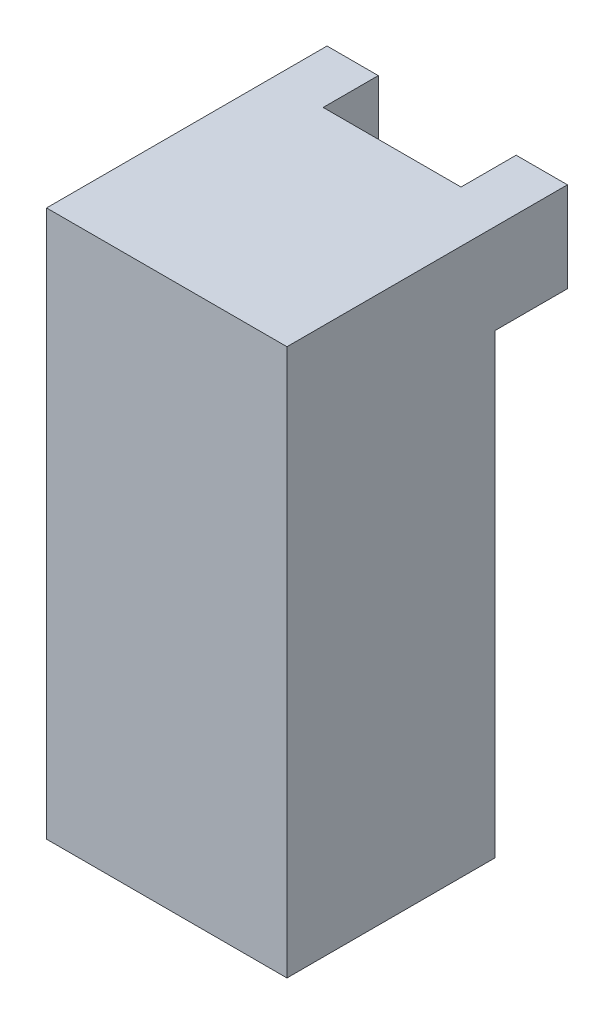
ISO-10303-21;
HEADER;
FILE_DESCRIPTION(('STEP AP214'),'2;1');
FILE_NAME('part.step','',(''),(''),'','','');
FILE_SCHEMA(('AUTOMOTIVE_DESIGN { 1 0 10303 214 1 1 1 1 }'));
ENDSEC;
DATA;
#1=APPLICATION_CONTEXT('core data for automotive mechanical design processes');
#2=APPLICATION_PROTOCOL_DEFINITION('international standard','automotive_design',2000,#1);
#3=PRODUCT_CONTEXT('',#1,'mechanical');
#4=PRODUCT('Part','Part','',(#3));
#5=PRODUCT_RELATED_PRODUCT_CATEGORY('part','',(#4));
#6=PRODUCT_DEFINITION_FORMATION('','',#4);
#7=PRODUCT_DEFINITION_CONTEXT('part definition',#1,'design');
#8=PRODUCT_DEFINITION('design','',#6,#7);
#9=PRODUCT_DEFINITION_SHAPE('','',#8);
#10=(LENGTH_UNIT() NAMED_UNIT(*) SI_UNIT(.MILLI.,.METRE.));
#11=(NAMED_UNIT(*) PLANE_ANGLE_UNIT() SI_UNIT($,.RADIAN.));
#12=(NAMED_UNIT(*) SI_UNIT($,.STERADIAN.) SOLID_ANGLE_UNIT());
#13=UNCERTAINTY_MEASURE_WITH_UNIT(LENGTH_MEASURE(1.E-05),#10,'distance_accuracy_value','');
#14=(GEOMETRIC_REPRESENTATION_CONTEXT(3) GLOBAL_UNCERTAINTY_ASSIGNED_CONTEXT((#13)) GLOBAL_UNIT_ASSIGNED_CONTEXT((#10,
#11,#12)) REPRESENTATION_CONTEXT('',''));
#15=CARTESIAN_POINT('',(0.,0.,0.));
#16=DIRECTION('',(0.,0.,1.));
#17=DIRECTION('',(1.,0.,0.));
#18=AXIS2_PLACEMENT_3D('',#15,#16,#17);
#19=CARTESIAN_POINT('',(-2.79000000000003,6.345,-2.4149999999999));
#20=DIRECTION('',(0.,0.,1.));
#21=DIRECTION('',(1.,0.,0.));
#22=AXIS2_PLACEMENT_3D('',#19,#20,#21);
#23=PLANE('',#22);
#24=DIRECTION('',(1.,0.,0.));
#25=VECTOR('',#24,1.);
#26=CARTESIAN_POINT('',(-2.79000000000003,4.255,-2.4149999999999));
#27=LINE('',#26,#25);
#28=CARTESIAN_POINT('',(-2.79000000000003,4.255,-2.4149999999999));
#29=VERTEX_POINT('',#28);
#30=CARTESIAN_POINT('',(2.78999999999996,4.255,-2.41499999999992));
#31=VERTEX_POINT('',#30);
#32=EDGE_CURVE('E142',#29,#31,#27,.T.);
#33=ORIENTED_EDGE('',*,*,#32,.T.);
#34=DIRECTION('',(0.,-1.,0.));
#35=VECTOR('',#34,1.);
#36=CARTESIAN_POINT('',(2.78999999999996,6.345,-2.41499999999992));
#37=LINE('',#36,#35);
#38=CARTESIAN_POINT('',(2.78999999999997,-6.345,-2.41499999999993));
#39=VERTEX_POINT('',#38);
#40=EDGE_CURVE('E11',#31,#39,#37,.T.);
#41=ORIENTED_EDGE('',*,*,#40,.T.);
#42=DIRECTION('',(-1.,0.,0.));
#43=VECTOR('',#42,1.);
#44=CARTESIAN_POINT('',(-2.79000000000003,-6.345,-2.41499999999992));
#45=LINE('',#44,#43);
#46=CARTESIAN_POINT('',(-2.79000000000003,-6.345,-2.41499999999992));
#47=VERTEX_POINT('',#46);
#48=EDGE_CURVE('E168',#39,#47,#45,.T.);
#49=ORIENTED_EDGE('',*,*,#48,.T.);
#50=DIRECTION('',(0.,-1.,0.));
#51=VECTOR('',#50,1.);
#52=CARTESIAN_POINT('',(-2.79000000000003,6.345,-2.4149999999999));
#53=LINE('',#52,#51);
#54=EDGE_CURVE('E38',#29,#47,#53,.T.);
#55=ORIENTED_EDGE('',*,*,#54,.F.);
#56=EDGE_LOOP('',(#33,#41,#49,#55));
#57=FACE_BOUND('',#56,.T.);
#58=ADVANCED_FACE('F30',(#57),#23,.F.);
#59=CARTESIAN_POINT('',(2.78999999999998,6.345,2.41500000000001));
#60=DIRECTION('',(-1.,0.,0.));
#61=DIRECTION('',(0.,0.,1.));
#62=AXIS2_PLACEMENT_3D('',#59,#60,#61);
#63=PLANE('',#62);
#64=DIRECTION('',(0.,0.,-1.));
#65=VECTOR('',#64,1.);
#66=CARTESIAN_POINT('',(2.78999999999998,-6.345,2.41500000000004));
#67=LINE('',#66,#65);
#68=CARTESIAN_POINT('',(2.78999999999998,-6.345,2.41500000000004));
#69=VERTEX_POINT('',#68);
#70=EDGE_CURVE('E157',#69,#39,#67,.T.);
#71=ORIENTED_EDGE('',*,*,#70,.T.);
#72=ORIENTED_EDGE('',*,*,#40,.F.);
#73=DIRECTION('',(0.,0.,-1.));
#74=VECTOR('',#73,1.);
#75=CARTESIAN_POINT('',(2.78999999999996,4.255,-2.41499999999992));
#76=LINE('',#75,#74);
#77=CARTESIAN_POINT('',(2.78999999999996,4.255,-4.09499999999995));
#78=VERTEX_POINT('',#77);
#79=EDGE_CURVE('E122',#31,#78,#76,.T.);
#80=ORIENTED_EDGE('',*,*,#79,.T.);
#81=DIRECTION('',(0.,1.,0.));
#82=VECTOR('',#81,1.);
#83=CARTESIAN_POINT('',(2.78999999999996,4.255,-4.09499999999995));
#84=LINE('',#83,#82);
#85=CARTESIAN_POINT('',(2.78999999999996,6.345,-4.09499999999995));
#86=VERTEX_POINT('',#85);
#87=EDGE_CURVE('E105',#78,#86,#84,.T.);
#88=ORIENTED_EDGE('',*,*,#87,.T.);
#89=DIRECTION('',(0.,0.,-1.));
#90=VECTOR('',#89,1.);
#91=CARTESIAN_POINT('',(2.78999999999998,6.345,2.41500000000001));
#92=LINE('',#91,#90);
#93=CARTESIAN_POINT('',(2.78999999999998,6.345,2.41500000000001));
#94=VERTEX_POINT('',#93);
#95=EDGE_CURVE('E159',#94,#86,#92,.T.);
#96=ORIENTED_EDGE('',*,*,#95,.F.);
#97=DIRECTION('',(0.,-1.,0.));
#98=VECTOR('',#97,1.);
#99=CARTESIAN_POINT('',(2.78999999999998,6.345,2.41500000000001));
#100=LINE('',#99,#98);
#101=EDGE_CURVE('E166',#94,#69,#100,.T.);
#102=ORIENTED_EDGE('',*,*,#101,.T.);
#103=EDGE_LOOP('',(#71,#72,#80,#88,#96,#102));
#104=FACE_BOUND('',#103,.T.);
#105=ADVANCED_FACE('F32',(#104),#63,.F.);
#106=CARTESIAN_POINT('',(-2.79000000000004,6.345,2.41500000000007));
#107=DIRECTION('',(1.,0.,0.));
#108=DIRECTION('',(0.,0.,-1.));
#109=AXIS2_PLACEMENT_3D('',#106,#107,#108);
#110=PLANE('',#109);
#111=DIRECTION('',(0.,0.,1.));
#112=VECTOR('',#111,1.);
#113=CARTESIAN_POINT('',(-2.79000000000004,-6.345,2.41500000000008));
#114=LINE('',#113,#112);
#115=CARTESIAN_POINT('',(-2.79000000000004,-6.345,2.41500000000008));
#116=VERTEX_POINT('',#115);
#117=EDGE_CURVE('E171',#47,#116,#114,.T.);
#118=ORIENTED_EDGE('',*,*,#117,.T.);
#119=DIRECTION('',(0.,-1.,0.));
#120=VECTOR('',#119,1.);
#121=CARTESIAN_POINT('',(-2.79000000000004,6.345,2.41500000000007));
#122=LINE('',#121,#120);
#123=CARTESIAN_POINT('',(-2.79000000000004,6.345,2.41500000000007));
#124=VERTEX_POINT('',#123);
#125=EDGE_CURVE('E176',#124,#116,#122,.T.);
#126=ORIENTED_EDGE('',*,*,#125,.F.);
#127=DIRECTION('',(0.,0.,1.));
#128=VECTOR('',#127,1.);
#129=CARTESIAN_POINT('',(-2.79000000000004,6.345,2.41500000000007));
#130=LINE('',#129,#128);
#131=CARTESIAN_POINT('',(-2.79000000000002,6.345,-4.09499999999995));
#132=VERTEX_POINT('',#131);
#133=EDGE_CURVE('E161',#132,#124,#130,.T.);
#134=ORIENTED_EDGE('',*,*,#133,.F.);
#135=DIRECTION('',(0.,1.,0.));
#136=VECTOR('',#135,1.);
#137=CARTESIAN_POINT('',(-2.79000000000002,4.255,-4.09499999999995));
#138=LINE('',#137,#136);
#139=CARTESIAN_POINT('',(-2.79000000000002,4.255,-4.09499999999995));
#140=VERTEX_POINT('',#139);
#141=EDGE_CURVE('E154',#140,#132,#138,.T.);
#142=ORIENTED_EDGE('',*,*,#141,.F.);
#143=DIRECTION('',(0.,0.,1.));
#144=VECTOR('',#143,1.);
#145=CARTESIAN_POINT('',(-2.79000000000003,4.255,-2.4149999999999));
#146=LINE('',#145,#144);
#147=EDGE_CURVE('E139',#140,#29,#146,.T.);
#148=ORIENTED_EDGE('',*,*,#147,.T.);
#149=ORIENTED_EDGE('',*,*,#54,.T.);
#150=EDGE_LOOP('',(#118,#126,#134,#142,#148,#149));
#151=FACE_BOUND('',#150,.T.);
#152=ADVANCED_FACE('F180',(#151),#110,.F.);
#153=CARTESIAN_POINT('',(-2.79000000000004,6.345,2.41500000000007));
#154=DIRECTION('',(0.,0.,-1.));
#155=DIRECTION('',(-1.,0.,0.));
#156=AXIS2_PLACEMENT_3D('',#153,#154,#155);
#157=PLANE('',#156);
#158=DIRECTION('',(1.,0.,0.));
#159=VECTOR('',#158,1.);
#160=CARTESIAN_POINT('',(-2.79000000000004,-6.345,2.41500000000008));
#161=LINE('',#160,#159);
#162=EDGE_CURVE('E162',#116,#69,#161,.T.);
#163=ORIENTED_EDGE('',*,*,#162,.T.);
#164=ORIENTED_EDGE('',*,*,#101,.F.);
#165=DIRECTION('',(1.,0.,0.));
#166=VECTOR('',#165,1.);
#167=CARTESIAN_POINT('',(-2.79000000000004,6.345,2.41500000000007));
#168=LINE('',#167,#166);
#169=EDGE_CURVE('E164',#124,#94,#168,.T.);
#170=ORIENTED_EDGE('',*,*,#169,.F.);
#171=ORIENTED_EDGE('',*,*,#125,.T.);
#172=EDGE_LOOP('',(#163,#164,#170,#171));
#173=FACE_BOUND('',#172,.T.);
#174=ADVANCED_FACE('F191',(#173),#157,.F.);
#175=CARTESIAN_POINT('',(0.,6.345,0.));
#176=DIRECTION('',(0.,-1.,0.));
#177=DIRECTION('',(0.,0.,-1.));
#178=AXIS2_PLACEMENT_3D('',#175,#176,#177);
#179=PLANE('',#178);
#180=DIRECTION('',(-1.,0.,0.));
#181=VECTOR('',#180,1.);
#182=CARTESIAN_POINT('',(-1.60000000000002,6.345,-2.81499999999997));
#183=LINE('',#182,#181);
#184=CARTESIAN_POINT('',(1.6,6.345,-2.815));
#185=VERTEX_POINT('',#184);
#186=CARTESIAN_POINT('',(-1.60000000000002,6.345,-2.81499999999997));
#187=VERTEX_POINT('',#186);
#188=EDGE_CURVE('E208',#185,#187,#183,.T.);
#189=ORIENTED_EDGE('',*,*,#188,.T.);
#190=DIRECTION('',(0.,0.,-1.));
#191=VECTOR('',#190,1.);
#192=CARTESIAN_POINT('',(-1.60000000000004,6.345,-2.41499999999994));
#193=LINE('',#192,#191);
#194=CARTESIAN_POINT('',(-1.60000000000004,6.345,-4.09499999999992));
#195=VERTEX_POINT('',#194);
#196=EDGE_CURVE('E45',#187,#195,#193,.T.);
#197=ORIENTED_EDGE('',*,*,#196,.T.);
#198=DIRECTION('',(-1.,0.,0.));
#199=VECTOR('',#198,1.);
#200=CARTESIAN_POINT('',(-2.79000000000002,6.345,-4.09499999999995));
#201=LINE('',#200,#199);
#202=EDGE_CURVE('E143',#195,#132,#201,.T.);
#203=ORIENTED_EDGE('',*,*,#202,.T.);
#204=ORIENTED_EDGE('',*,*,#133,.T.);
#205=ORIENTED_EDGE('',*,*,#169,.T.);
#206=ORIENTED_EDGE('',*,*,#95,.T.);
#207=DIRECTION('',(-1.,0.,0.));
#208=VECTOR('',#207,1.);
#209=CARTESIAN_POINT('',(2.78999999999996,6.345,-4.09499999999995));
#210=LINE('',#209,#208);
#211=CARTESIAN_POINT('',(1.59999999999998,6.345,-4.09499999999992));
#212=VERTEX_POINT('',#211);
#213=EDGE_CURVE('E110',#86,#212,#210,.T.);
#214=ORIENTED_EDGE('',*,*,#213,.T.);
#215=DIRECTION('',(0.,0.,1.));
#216=VECTOR('',#215,1.);
#217=CARTESIAN_POINT('',(1.60000000000001,6.345,-2.415));
#218=LINE('',#217,#216);
#219=EDGE_CURVE('E127',#212,#185,#218,.T.);
#220=ORIENTED_EDGE('',*,*,#219,.T.);
#221=EDGE_LOOP('',(#189,#197,#203,#204,#205,#206,#214,#220));
#222=FACE_BOUND('',#221,.T.);
#223=ADVANCED_FACE('F195',(#222),#179,.F.);
#224=CARTESIAN_POINT('',(0.,-6.345,0.));
#225=DIRECTION('',(0.,-1.,0.));
#226=DIRECTION('',(0.,0.,-1.));
#227=AXIS2_PLACEMENT_3D('',#224,#225,#226);
#228=PLANE('',#227);
#229=ORIENTED_EDGE('',*,*,#70,.F.);
#230=ORIENTED_EDGE('',*,*,#162,.F.);
#231=ORIENTED_EDGE('',*,*,#117,.F.);
#232=ORIENTED_EDGE('',*,*,#48,.F.);
#233=EDGE_LOOP('',(#229,#230,#231,#232));
#234=FACE_BOUND('',#233,.T.);
#235=ADVANCED_FACE('F188',(#234),#228,.T.);
#236=CARTESIAN_POINT('',(-2.79000000000002,4.255,-4.09499999999995));
#237=DIRECTION('',(0.,0.,-1.));
#238=DIRECTION('',(-1.,0.,0.));
#239=AXIS2_PLACEMENT_3D('',#236,#237,#238);
#240=PLANE('',#239);
#241=ORIENTED_EDGE('',*,*,#202,.F.);
#242=DIRECTION('',(0.,1.,0.));
#243=VECTOR('',#242,1.);
#244=CARTESIAN_POINT('',(-1.60000000000004,4.255,-4.09499999999992));
#245=LINE('',#244,#243);
#246=CARTESIAN_POINT('',(-1.60000000000004,4.255,-4.09499999999992));
#247=VERTEX_POINT('',#246);
#248=EDGE_CURVE('E150',#247,#195,#245,.T.);
#249=ORIENTED_EDGE('',*,*,#248,.F.);
#250=DIRECTION('',(-1.,0.,0.));
#251=VECTOR('',#250,1.);
#252=CARTESIAN_POINT('',(-2.79000000000002,4.255,-4.09499999999995));
#253=LINE('',#252,#251);
#254=EDGE_CURVE('E147',#247,#140,#253,.T.);
#255=ORIENTED_EDGE('',*,*,#254,.T.);
#256=ORIENTED_EDGE('',*,*,#141,.T.);
#257=EDGE_LOOP('',(#241,#249,#255,#256));
#258=FACE_BOUND('',#257,.T.);
#259=ADVANCED_FACE('F198',(#258),#240,.T.);
#260=CARTESIAN_POINT('',(-1.60000000000004,4.255,-2.41499999999994));
#261=DIRECTION('',(1.,0.,0.));
#262=DIRECTION('',(0.,0.,-1.));
#263=AXIS2_PLACEMENT_3D('',#260,#261,#262);
#264=PLANE('',#263);
#265=DIRECTION('',(0.,1.,0.));
#266=VECTOR('',#265,1.);
#267=CARTESIAN_POINT('',(-1.60000000000002,1.03009690068058,-2.81499999999997));
#268=LINE('',#267,#266);
#269=CARTESIAN_POINT('',(-1.60000000000002,4.255,-2.81499999999997));
#270=VERTEX_POINT('',#269);
#271=EDGE_CURVE('E49',#270,#187,#268,.T.);
#272=ORIENTED_EDGE('',*,*,#271,.F.);
#273=DIRECTION('',(0.,0.,-1.));
#274=VECTOR('',#273,1.);
#275=CARTESIAN_POINT('',(-1.60000000000004,4.255,-2.41499999999994));
#276=LINE('',#275,#274);
#277=EDGE_CURVE('E145',#270,#247,#276,.T.);
#278=ORIENTED_EDGE('',*,*,#277,.T.);
#279=ORIENTED_EDGE('',*,*,#248,.T.);
#280=ORIENTED_EDGE('',*,*,#196,.F.);
#281=EDGE_LOOP('',(#272,#278,#279,#280));
#282=FACE_BOUND('',#281,.T.);
#283=ADVANCED_FACE('F219',(#282),#264,.T.);
#284=CARTESIAN_POINT('',(0.,4.255,0.));
#285=DIRECTION('',(0.,-1.,0.));
#286=DIRECTION('',(0.,0.,-1.));
#287=AXIS2_PLACEMENT_3D('',#284,#285,#286);
#288=PLANE('',#287);
#289=ORIENTED_EDGE('',*,*,#147,.F.);
#290=ORIENTED_EDGE('',*,*,#254,.F.);
#291=ORIENTED_EDGE('',*,*,#277,.F.);
#292=DIRECTION('',(1.,0.,0.));
#293=VECTOR('',#292,1.);
#294=CARTESIAN_POINT('',(-1.60000000000002,4.255,-2.81499999999997));
#295=LINE('',#294,#293);
#296=CARTESIAN_POINT('',(1.6,4.255,-2.815));
#297=VERTEX_POINT('',#296);
#298=EDGE_CURVE('E136',#270,#297,#295,.T.);
#299=ORIENTED_EDGE('',*,*,#298,.T.);
#300=DIRECTION('',(0.,0.,1.));
#301=VECTOR('',#300,1.);
#302=CARTESIAN_POINT('',(1.60000000000001,4.255,-2.415));
#303=LINE('',#302,#301);
#304=CARTESIAN_POINT('',(1.59999999999998,4.255,-4.09499999999992));
#305=VERTEX_POINT('',#304);
#306=EDGE_CURVE('E115',#305,#297,#303,.T.);
#307=ORIENTED_EDGE('',*,*,#306,.F.);
#308=DIRECTION('',(-1.,0.,0.));
#309=VECTOR('',#308,1.);
#310=CARTESIAN_POINT('',(2.78999999999996,4.255,-4.09499999999995));
#311=LINE('',#310,#309);
#312=EDGE_CURVE('E108',#78,#305,#311,.T.);
#313=ORIENTED_EDGE('',*,*,#312,.F.);
#314=ORIENTED_EDGE('',*,*,#79,.F.);
#315=ORIENTED_EDGE('',*,*,#32,.F.);
#316=EDGE_LOOP('',(#289,#290,#291,#299,#307,#313,#314,#315));
#317=FACE_BOUND('',#316,.T.);
#318=ADVANCED_FACE('F121',(#317),#288,.T.);
#319=CARTESIAN_POINT('',(1.60000000000001,4.255,-2.415));
#320=DIRECTION('',(-1.,0.,0.));
#321=DIRECTION('',(0.,0.,1.));
#322=AXIS2_PLACEMENT_3D('',#319,#320,#321);
#323=PLANE('',#322);
#324=DIRECTION('',(0.,1.,0.));
#325=VECTOR('',#324,1.);
#326=CARTESIAN_POINT('',(1.6,1.03009690068058,-2.815));
#327=LINE('',#326,#325);
#328=EDGE_CURVE('E132',#297,#185,#327,.T.);
#329=ORIENTED_EDGE('',*,*,#328,.T.);
#330=ORIENTED_EDGE('',*,*,#219,.F.);
#331=DIRECTION('',(0.,1.,0.));
#332=VECTOR('',#331,1.);
#333=CARTESIAN_POINT('',(1.59999999999998,4.255,-4.09499999999992));
#334=LINE('',#333,#332);
#335=EDGE_CURVE('E114',#305,#212,#334,.T.);
#336=ORIENTED_EDGE('',*,*,#335,.F.);
#337=ORIENTED_EDGE('',*,*,#306,.T.);
#338=EDGE_LOOP('',(#329,#330,#336,#337));
#339=FACE_BOUND('',#338,.T.);
#340=ADVANCED_FACE('F211',(#339),#323,.T.);
#341=CARTESIAN_POINT('',(2.78999999999996,4.255,-4.09499999999995));
#342=DIRECTION('',(0.,0.,-1.));
#343=DIRECTION('',(-1.,0.,0.));
#344=AXIS2_PLACEMENT_3D('',#341,#342,#343);
#345=PLANE('',#344);
#346=ORIENTED_EDGE('',*,*,#213,.F.);
#347=ORIENTED_EDGE('',*,*,#87,.F.);
#348=ORIENTED_EDGE('',*,*,#312,.T.);
#349=ORIENTED_EDGE('',*,*,#335,.T.);
#350=EDGE_LOOP('',(#346,#347,#348,#349));
#351=FACE_BOUND('',#350,.T.);
#352=ADVANCED_FACE('F107',(#351),#345,.T.);
#353=CARTESIAN_POINT('',(-1.60000000000002,1.03009690068058,-2.81499999999997));
#354=DIRECTION('',(0.,0.,-1.));
#355=DIRECTION('',(-1.,0.,0.));
#356=AXIS2_PLACEMENT_3D('',#353,#354,#355);
#357=PLANE('',#356);
#358=ORIENTED_EDGE('',*,*,#298,.F.);
#359=ORIENTED_EDGE('',*,*,#271,.T.);
#360=ORIENTED_EDGE('',*,*,#188,.F.);
#361=ORIENTED_EDGE('',*,*,#328,.F.);
#362=EDGE_LOOP('',(#358,#359,#360,#361));
#363=FACE_BOUND('',#362,.T.);
#364=ADVANCED_FACE('F204',(#363),#357,.T.);
#365=CLOSED_SHELL('',(#58,#105,#152,#174,#223,#235,#259,#283,#318,#340,#352,#364));
#366=MANIFOLD_SOLID_BREP('B2',#365);
#367=ADVANCED_BREP_SHAPE_REPRESENTATION('',(#18,#366),#14);
#368=SHAPE_DEFINITION_REPRESENTATION(#9,#367);
ENDSEC;
END-ISO-10303-21;
